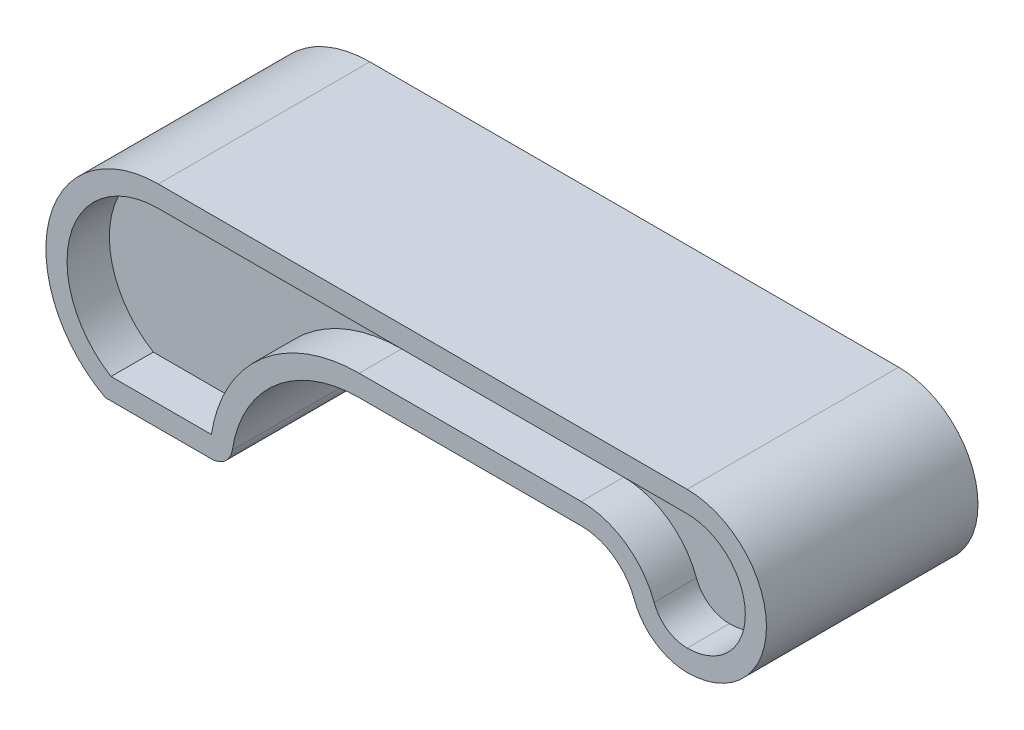
ISO-10303-21;
HEADER;
FILE_DESCRIPTION(('STEP AP214'),'2;1');
FILE_NAME('part.step','',(''),(''),'','','');
FILE_SCHEMA(('AUTOMOTIVE_DESIGN { 1 0 10303 214 1 1 1 1 }'));
ENDSEC;
DATA;
#1=APPLICATION_CONTEXT('core data for automotive mechanical design processes');
#2=APPLICATION_PROTOCOL_DEFINITION('international standard','automotive_design',2000,#1);
#3=PRODUCT_CONTEXT('',#1,'mechanical');
#4=PRODUCT('Part','Part','',(#3));
#5=PRODUCT_RELATED_PRODUCT_CATEGORY('part','',(#4));
#6=PRODUCT_DEFINITION_FORMATION('','',#4);
#7=PRODUCT_DEFINITION_CONTEXT('part definition',#1,'design');
#8=PRODUCT_DEFINITION('design','',#6,#7);
#9=PRODUCT_DEFINITION_SHAPE('','',#8);
#10=(LENGTH_UNIT() NAMED_UNIT(*) SI_UNIT(.MILLI.,.METRE.));
#11=(NAMED_UNIT(*) PLANE_ANGLE_UNIT() SI_UNIT($,.RADIAN.));
#12=(NAMED_UNIT(*) SI_UNIT($,.STERADIAN.) SOLID_ANGLE_UNIT());
#13=UNCERTAINTY_MEASURE_WITH_UNIT(LENGTH_MEASURE(1.E-05),#10,'distance_accuracy_value','');
#14=(GEOMETRIC_REPRESENTATION_CONTEXT(3) GLOBAL_UNCERTAINTY_ASSIGNED_CONTEXT((#13)) GLOBAL_UNIT_ASSIGNED_CONTEXT((#10,
#11,#12)) REPRESENTATION_CONTEXT('',''));
#15=CARTESIAN_POINT('',(0.,0.,0.));
#16=DIRECTION('',(0.,0.,1.));
#17=DIRECTION('',(1.,0.,0.));
#18=AXIS2_PLACEMENT_3D('',#15,#16,#17);
#19=CARTESIAN_POINT('',(10.,2.02380952380952,0.));
#20=DIRECTION('',(0.,0.,1.));
#21=DIRECTION('',(1.,0.,0.));
#22=AXIS2_PLACEMENT_3D('',#19,#20,#21);
#23=PLANE('',#22);
#24=CARTESIAN_POINT('',(10.,2.02380952380952,0.));
#25=DIRECTION('',(0.,0.,1.));
#26=DIRECTION('',(1.,0.,0.));
#27=AXIS2_PLACEMENT_3D('',#24,#25,#26);
#28=CIRCLE('',#27,2.02380952380953);
#29=CARTESIAN_POINT('',(10.,0.,0.));
#30=VERTEX_POINT('',#29);
#31=CARTESIAN_POINT('',(12.,1.71428571428572,0.));
#32=VERTEX_POINT('',#31);
#33=EDGE_CURVE('E344',#30,#32,#28,.T.);
#34=ORIENTED_EDGE('',*,*,#33,.F.);
#35=DIRECTION('',(1.,0.,0.));
#36=VECTOR('',#35,1.);
#37=CARTESIAN_POINT('',(0.,0.,0.));
#38=LINE('',#37,#36);
#39=CARTESIAN_POINT('',(0.,0.,0.));
#40=VERTEX_POINT('',#39);
#41=EDGE_CURVE('E364',#40,#30,#38,.T.);
#42=ORIENTED_EDGE('',*,*,#41,.F.);
#43=CARTESIAN_POINT('',(5.,9.375,0.));
#44=DIRECTION('',(0.,0.,-1.));
#45=DIRECTION('',(-1.,0.,0.));
#46=AXIS2_PLACEMENT_3D('',#43,#44,#45);
#47=CIRCLE('',#46,10.625);
#48=CARTESIAN_POINT('',(5.,20.,0.));
#49=VERTEX_POINT('',#48);
#50=EDGE_CURVE('E407',#40,#49,#47,.T.);
#51=ORIENTED_EDGE('',*,*,#50,.T.);
#52=DIRECTION('',(1.,0.,0.));
#53=VECTOR('',#52,1.);
#54=CARTESIAN_POINT('',(5.,20.,0.));
#55=LINE('',#54,#53);
#56=CARTESIAN_POINT('',(55.,20.,0.));
#57=VERTEX_POINT('',#56);
#58=EDGE_CURVE('E404',#49,#57,#55,.T.);
#59=ORIENTED_EDGE('',*,*,#58,.T.);
#60=CARTESIAN_POINT('',(55.,12.5,0.));
#61=DIRECTION('',(0.,0.,-1.));
#62=DIRECTION('',(-1.,0.,0.));
#63=AXIS2_PLACEMENT_3D('',#60,#61,#62);
#64=CIRCLE('',#63,7.5);
#65=CARTESIAN_POINT('',(55.,5.,0.));
#66=VERTEX_POINT('',#65);
#67=EDGE_CURVE('E401',#57,#66,#64,.T.);
#68=ORIENTED_EDGE('',*,*,#67,.T.);
#69=CARTESIAN_POINT('',(55.,10.3214285714286,0.));
#70=DIRECTION('',(0.,0.,-1.));
#71=DIRECTION('',(-1.,0.,0.));
#72=AXIS2_PLACEMENT_3D('',#69,#70,#71);
#73=CIRCLE('',#72,5.32142857142856);
#74=CARTESIAN_POINT('',(50.,8.5,0.));
#75=VERTEX_POINT('',#74);
#76=EDGE_CURVE('E398',#66,#75,#73,.T.);
#77=ORIENTED_EDGE('',*,*,#76,.T.);
#78=CARTESIAN_POINT('',(45.,6.67857142857144,0.));
#79=DIRECTION('',(0.,0.,1.));
#80=DIRECTION('',(1.,0.,0.));
#81=AXIS2_PLACEMENT_3D('',#78,#79,#80);
#82=CIRCLE('',#81,5.32142857142857);
#83=CARTESIAN_POINT('',(45.,12.,0.));
#84=VERTEX_POINT('',#83);
#85=EDGE_CURVE('E395',#75,#84,#82,.T.);
#86=ORIENTED_EDGE('',*,*,#85,.T.);
#87=DIRECTION('',(-1.,0.,0.));
#88=VECTOR('',#87,1.);
#89=CARTESIAN_POINT('',(45.,12.,0.));
#90=LINE('',#89,#88);
#91=CARTESIAN_POINT('',(24.,12.,0.));
#92=VERTEX_POINT('',#91);
#93=EDGE_CURVE('E392',#84,#92,#90,.T.);
#94=ORIENTED_EDGE('',*,*,#93,.T.);
#95=CARTESIAN_POINT('',(24.,-0.142857142857146,0.));
#96=DIRECTION('',(0.,0.,-1.));
#97=DIRECTION('',(-1.,0.,0.));
#98=AXIS2_PLACEMENT_3D('',#95,#96,#97);
#99=CIRCLE('',#98,12.1428571428571);
#100=EDGE_CURVE('E389',#32,#92,#99,.T.);
#101=ORIENTED_EDGE('',*,*,#100,.F.);
#102=EDGE_LOOP('',(#34,#42,#51,#59,#68,#77,#86,#94,#101));
#103=FACE_BOUND('',#102,.T.);
#104=CARTESIAN_POINT('',(10.,2.02380952380952,0.));
#105=DIRECTION('',(0.,0.,1.));
#106=DIRECTION('',(1.,0.,0.));
#107=AXIS2_PLACEMENT_3D('',#104,#105,#106);
#108=CIRCLE('',#107,0.0238095238095249);
#109=CARTESIAN_POINT('',(10.,2.,0.));
#110=VERTEX_POINT('',#109);
#111=CARTESIAN_POINT('',(10.0235294117647,2.02016806722689,0.));
#112=VERTEX_POINT('',#111);
#113=EDGE_CURVE('E47',#110,#112,#108,.T.);
#114=ORIENTED_EDGE('',*,*,#113,.T.);
#115=CARTESIAN_POINT('',(24.,-0.142857142857146,0.));
#116=DIRECTION('',(0.,0.,-1.));
#117=DIRECTION('',(1.,0.,0.));
#118=AXIS2_PLACEMENT_3D('',#115,#116,#117);
#119=CIRCLE('',#118,14.1428571428571);
#120=CARTESIAN_POINT('',(24.,14.,0.));
#121=VERTEX_POINT('',#120);
#122=EDGE_CURVE('E232',#112,#121,#119,.T.);
#123=ORIENTED_EDGE('',*,*,#122,.T.);
#124=DIRECTION('',(1.,0.,0.));
#125=VECTOR('',#124,1.);
#126=CARTESIAN_POINT('',(24.,14.,0.));
#127=LINE('',#126,#125);
#128=CARTESIAN_POINT('',(45.,14.,0.));
#129=VERTEX_POINT('',#128);
#130=EDGE_CURVE('E235',#121,#129,#127,.T.);
#131=ORIENTED_EDGE('',*,*,#130,.T.);
#132=CARTESIAN_POINT('',(45.,6.67857142857144,0.));
#133=DIRECTION('',(0.,0.,-1.));
#134=DIRECTION('',(1.,0.,0.));
#135=AXIS2_PLACEMENT_3D('',#132,#133,#134);
#136=CIRCLE('',#135,7.32142857142856);
#137=CARTESIAN_POINT('',(51.8791946308725,9.18456375838926,0.));
#138=VERTEX_POINT('',#137);
#139=EDGE_CURVE('E269',#129,#138,#136,.T.);
#140=ORIENTED_EDGE('',*,*,#139,.T.);
#141=CARTESIAN_POINT('',(55.,10.3214285714286,0.));
#142=DIRECTION('',(0.,0.,1.));
#143=DIRECTION('',(1.,0.,0.));
#144=AXIS2_PLACEMENT_3D('',#141,#142,#143);
#145=CIRCLE('',#144,3.32142857142856);
#146=CARTESIAN_POINT('',(55.,7.,0.));
#147=VERTEX_POINT('',#146);
#148=EDGE_CURVE('E266',#138,#147,#145,.T.);
#149=ORIENTED_EDGE('',*,*,#148,.T.);
#150=CARTESIAN_POINT('',(55.,12.5,0.));
#151=DIRECTION('',(0.,0.,1.));
#152=DIRECTION('',(1.,0.,0.));
#153=AXIS2_PLACEMENT_3D('',#150,#151,#152);
#154=CIRCLE('',#153,5.5);
#155=CARTESIAN_POINT('',(55.,18.,0.));
#156=VERTEX_POINT('',#155);
#157=EDGE_CURVE('E263',#147,#156,#154,.T.);
#158=ORIENTED_EDGE('',*,*,#157,.T.);
#159=DIRECTION('',(-1.,0.,0.));
#160=VECTOR('',#159,1.);
#161=CARTESIAN_POINT('',(55.,18.,0.));
#162=LINE('',#161,#160);
#163=CARTESIAN_POINT('',(5.,18.,0.));
#164=VERTEX_POINT('',#163);
#165=EDGE_CURVE('E260',#156,#164,#162,.T.);
#166=ORIENTED_EDGE('',*,*,#165,.T.);
#167=CARTESIAN_POINT('',(5.,9.375,0.));
#168=DIRECTION('',(0.,0.,1.));
#169=DIRECTION('',(1.,0.,0.));
#170=AXIS2_PLACEMENT_3D('',#167,#168,#169);
#171=CIRCLE('',#170,8.625);
#172=CARTESIAN_POINT('',(0.527864045000413,2.,0.));
#173=VERTEX_POINT('',#172);
#174=EDGE_CURVE('E257',#164,#173,#171,.T.);
#175=ORIENTED_EDGE('',*,*,#174,.T.);
#176=DIRECTION('',(1.,0.,0.));
#177=VECTOR('',#176,1.);
#178=CARTESIAN_POINT('',(0.527864045000413,2.,0.));
#179=LINE('',#178,#177);
#180=EDGE_CURVE('E254',#173,#110,#179,.T.);
#181=ORIENTED_EDGE('',*,*,#180,.T.);
#182=EDGE_LOOP('',(#114,#123,#131,#140,#149,#158,#166,#175,#181));
#183=FACE_BOUND('',#182,.T.);
#184=ADVANCED_FACE('F32',(#103,#183),#23,.F.);
#185=CARTESIAN_POINT('',(10.,2.02380952380952,20.));
#186=DIRECTION('',(0.,0.,1.));
#187=DIRECTION('',(1.,0.,0.));
#188=AXIS2_PLACEMENT_3D('',#185,#186,#187);
#189=PLANE('',#188);
#190=CARTESIAN_POINT('',(10.,2.02380952380952,20.));
#191=DIRECTION('',(0.,0.,1.));
#192=DIRECTION('',(1.,0.,0.));
#193=AXIS2_PLACEMENT_3D('',#190,#191,#192);
#194=CIRCLE('',#193,2.02380952380953);
#195=CARTESIAN_POINT('',(10.,0.,20.));
#196=VERTEX_POINT('',#195);
#197=CARTESIAN_POINT('',(12.,1.71428571428572,20.));
#198=VERTEX_POINT('',#197);
#199=EDGE_CURVE('E360',#196,#198,#194,.T.);
#200=ORIENTED_EDGE('',*,*,#199,.T.);
#201=CARTESIAN_POINT('',(24.,-0.142857142857146,20.));
#202=DIRECTION('',(0.,0.,-1.));
#203=DIRECTION('',(-1.,0.,0.));
#204=AXIS2_PLACEMENT_3D('',#201,#202,#203);
#205=CIRCLE('',#204,12.1428571428571);
#206=CARTESIAN_POINT('',(24.,12.,20.));
#207=VERTEX_POINT('',#206);
#208=EDGE_CURVE('E363',#198,#207,#205,.T.);
#209=ORIENTED_EDGE('',*,*,#208,.T.);
#210=DIRECTION('',(-1.,0.,0.));
#211=VECTOR('',#210,1.);
#212=CARTESIAN_POINT('',(45.,12.,20.));
#213=LINE('',#212,#211);
#214=CARTESIAN_POINT('',(45.,12.,20.));
#215=VERTEX_POINT('',#214);
#216=EDGE_CURVE('E366',#215,#207,#213,.T.);
#217=ORIENTED_EDGE('',*,*,#216,.F.);
#218=CARTESIAN_POINT('',(45.,6.67857142857144,20.));
#219=DIRECTION('',(0.,0.,1.));
#220=DIRECTION('',(1.,0.,0.));
#221=AXIS2_PLACEMENT_3D('',#218,#219,#220);
#222=CIRCLE('',#221,5.32142857142857);
#223=CARTESIAN_POINT('',(50.,8.5,20.));
#224=VERTEX_POINT('',#223);
#225=EDGE_CURVE('E369',#224,#215,#222,.T.);
#226=ORIENTED_EDGE('',*,*,#225,.F.);
#227=CARTESIAN_POINT('',(55.,10.3214285714286,20.));
#228=DIRECTION('',(0.,0.,-1.));
#229=DIRECTION('',(-1.,0.,0.));
#230=AXIS2_PLACEMENT_3D('',#227,#228,#229);
#231=CIRCLE('',#230,5.32142857142856);
#232=CARTESIAN_POINT('',(55.,5.,20.));
#233=VERTEX_POINT('',#232);
#234=EDGE_CURVE('E372',#233,#224,#231,.T.);
#235=ORIENTED_EDGE('',*,*,#234,.F.);
#236=CARTESIAN_POINT('',(55.,12.5,20.));
#237=DIRECTION('',(0.,0.,-1.));
#238=DIRECTION('',(-1.,0.,0.));
#239=AXIS2_PLACEMENT_3D('',#236,#237,#238);
#240=CIRCLE('',#239,7.5);
#241=CARTESIAN_POINT('',(55.,20.,20.));
#242=VERTEX_POINT('',#241);
#243=EDGE_CURVE('E375',#242,#233,#240,.T.);
#244=ORIENTED_EDGE('',*,*,#243,.F.);
#245=DIRECTION('',(1.,0.,0.));
#246=VECTOR('',#245,1.);
#247=CARTESIAN_POINT('',(5.,20.,20.));
#248=LINE('',#247,#246);
#249=CARTESIAN_POINT('',(5.,20.,20.));
#250=VERTEX_POINT('',#249);
#251=EDGE_CURVE('E378',#250,#242,#248,.T.);
#252=ORIENTED_EDGE('',*,*,#251,.F.);
#253=CARTESIAN_POINT('',(5.,9.375,20.));
#254=DIRECTION('',(0.,0.,-1.));
#255=DIRECTION('',(-1.,0.,0.));
#256=AXIS2_PLACEMENT_3D('',#253,#254,#255);
#257=CIRCLE('',#256,10.625);
#258=CARTESIAN_POINT('',(0.,0.,20.));
#259=VERTEX_POINT('',#258);
#260=EDGE_CURVE('E381',#259,#250,#257,.T.);
#261=ORIENTED_EDGE('',*,*,#260,.F.);
#262=DIRECTION('',(1.,0.,0.));
#263=VECTOR('',#262,1.);
#264=CARTESIAN_POINT('',(0.,0.,20.));
#265=LINE('',#264,#263);
#266=EDGE_CURVE('E384',#259,#196,#265,.T.);
#267=ORIENTED_EDGE('',*,*,#266,.T.);
#268=EDGE_LOOP('',(#200,#209,#217,#226,#235,#244,#252,#261,#267));
#269=FACE_BOUND('',#268,.T.);
#270=CARTESIAN_POINT('',(10.,2.02380952380952,20.));
#271=DIRECTION('',(0.,0.,1.));
#272=DIRECTION('',(1.,0.,0.));
#273=AXIS2_PLACEMENT_3D('',#270,#271,#272);
#274=CIRCLE('',#273,0.0238095238095249);
#275=CARTESIAN_POINT('',(10.,2.,20.));
#276=VERTEX_POINT('',#275);
#277=CARTESIAN_POINT('',(10.0235294117647,2.02016806722689,20.));
#278=VERTEX_POINT('',#277);
#279=EDGE_CURVE('E55',#276,#278,#274,.T.);
#280=ORIENTED_EDGE('',*,*,#279,.F.);
#281=DIRECTION('',(1.,0.,0.));
#282=VECTOR('',#281,1.);
#283=CARTESIAN_POINT('',(0.527864045000413,2.,20.));
#284=LINE('',#283,#282);
#285=CARTESIAN_POINT('',(0.527864045000413,2.,20.));
#286=VERTEX_POINT('',#285);
#287=EDGE_CURVE('E293',#286,#276,#284,.T.);
#288=ORIENTED_EDGE('',*,*,#287,.F.);
#289=CARTESIAN_POINT('',(5.,9.375,20.));
#290=DIRECTION('',(0.,0.,1.));
#291=DIRECTION('',(1.,0.,0.));
#292=AXIS2_PLACEMENT_3D('',#289,#290,#291);
#293=CIRCLE('',#292,8.625);
#294=CARTESIAN_POINT('',(5.,18.,20.));
#295=VERTEX_POINT('',#294);
#296=EDGE_CURVE('E337',#295,#286,#293,.T.);
#297=ORIENTED_EDGE('',*,*,#296,.F.);
#298=DIRECTION('',(-1.,0.,0.));
#299=VECTOR('',#298,1.);
#300=CARTESIAN_POINT('',(55.,18.,20.));
#301=LINE('',#300,#299);
#302=CARTESIAN_POINT('',(55.,18.,20.));
#303=VERTEX_POINT('',#302);
#304=EDGE_CURVE('E334',#303,#295,#301,.T.);
#305=ORIENTED_EDGE('',*,*,#304,.F.);
#306=CARTESIAN_POINT('',(55.,12.5,20.));
#307=DIRECTION('',(0.,0.,1.));
#308=DIRECTION('',(1.,0.,0.));
#309=AXIS2_PLACEMENT_3D('',#306,#307,#308);
#310=CIRCLE('',#309,5.5);
#311=CARTESIAN_POINT('',(55.,7.,20.));
#312=VERTEX_POINT('',#311);
#313=EDGE_CURVE('E331',#312,#303,#310,.T.);
#314=ORIENTED_EDGE('',*,*,#313,.F.);
#315=CARTESIAN_POINT('',(55.,10.3214285714286,20.));
#316=DIRECTION('',(0.,0.,1.));
#317=DIRECTION('',(1.,0.,0.));
#318=AXIS2_PLACEMENT_3D('',#315,#316,#317);
#319=CIRCLE('',#318,3.32142857142856);
#320=CARTESIAN_POINT('',(51.8791946308725,9.18456375838926,20.));
#321=VERTEX_POINT('',#320);
#322=EDGE_CURVE('E328',#321,#312,#319,.T.);
#323=ORIENTED_EDGE('',*,*,#322,.F.);
#324=CARTESIAN_POINT('',(45.,6.67857142857144,20.));
#325=DIRECTION('',(0.,0.,-1.));
#326=DIRECTION('',(1.,0.,0.));
#327=AXIS2_PLACEMENT_3D('',#324,#325,#326);
#328=CIRCLE('',#327,7.32142857142856);
#329=CARTESIAN_POINT('',(45.,14.,20.));
#330=VERTEX_POINT('',#329);
#331=EDGE_CURVE('E325',#330,#321,#328,.T.);
#332=ORIENTED_EDGE('',*,*,#331,.F.);
#333=DIRECTION('',(1.,0.,0.));
#334=VECTOR('',#333,1.);
#335=CARTESIAN_POINT('',(24.,14.,20.));
#336=LINE('',#335,#334);
#337=CARTESIAN_POINT('',(24.,14.,20.));
#338=VERTEX_POINT('',#337);
#339=EDGE_CURVE('E322',#338,#330,#336,.T.);
#340=ORIENTED_EDGE('',*,*,#339,.F.);
#341=CARTESIAN_POINT('',(24.,-0.142857142857146,20.));
#342=DIRECTION('',(0.,0.,-1.));
#343=DIRECTION('',(1.,0.,0.));
#344=AXIS2_PLACEMENT_3D('',#341,#342,#343);
#345=CIRCLE('',#344,14.1428571428571);
#346=EDGE_CURVE('E319',#278,#338,#345,.T.);
#347=ORIENTED_EDGE('',*,*,#346,.F.);
#348=EDGE_LOOP('',(#280,#288,#297,#305,#314,#323,#332,#340,#347));
#349=FACE_BOUND('',#348,.T.);
#350=ADVANCED_FACE('F441',(#269,#349),#189,.T.);
#351=CARTESIAN_POINT('',(10.,2.02380952380952,20.));
#352=DIRECTION('',(0.,0.,-1.));
#353=DIRECTION('',(-1.,0.,0.));
#354=AXIS2_PLACEMENT_3D('',#351,#352,#353);
#355=CYLINDRICAL_SURFACE('',#354,2.02380952380953);
#356=ORIENTED_EDGE('',*,*,#33,.T.);
#357=DIRECTION('',(0.,0.,-1.));
#358=VECTOR('',#357,1.);
#359=CARTESIAN_POINT('',(12.,1.71428571428572,20.));
#360=LINE('',#359,#358);
#361=EDGE_CURVE('E11',#198,#32,#360,.T.);
#362=ORIENTED_EDGE('',*,*,#361,.F.);
#363=ORIENTED_EDGE('',*,*,#199,.F.);
#364=DIRECTION('',(0.,0.,-1.));
#365=VECTOR('',#364,1.);
#366=CARTESIAN_POINT('',(10.,0.,20.));
#367=LINE('',#366,#365);
#368=EDGE_CURVE('E386',#196,#30,#367,.T.);
#369=ORIENTED_EDGE('',*,*,#368,.T.);
#370=EDGE_LOOP('',(#356,#362,#363,#369));
#371=FACE_BOUND('',#370,.T.);
#372=ADVANCED_FACE('F34',(#371),#355,.T.);
#373=CARTESIAN_POINT('',(24.,-0.142857142857146,20.));
#374=DIRECTION('',(0.,0.,-1.));
#375=DIRECTION('',(-1.,0.,0.));
#376=AXIS2_PLACEMENT_3D('',#373,#374,#375);
#377=CYLINDRICAL_SURFACE('',#376,12.1428571428571);
#378=ORIENTED_EDGE('',*,*,#100,.T.);
#379=DIRECTION('',(0.,0.,-1.));
#380=VECTOR('',#379,1.);
#381=CARTESIAN_POINT('',(24.,12.,20.));
#382=LINE('',#381,#380);
#383=EDGE_CURVE('E40',#207,#92,#382,.T.);
#384=ORIENTED_EDGE('',*,*,#383,.F.);
#385=ORIENTED_EDGE('',*,*,#208,.F.);
#386=ORIENTED_EDGE('',*,*,#361,.T.);
#387=EDGE_LOOP('',(#378,#384,#385,#386));
#388=FACE_BOUND('',#387,.T.);
#389=ADVANCED_FACE('F430',(#388),#377,.F.);
#390=CARTESIAN_POINT('',(45.,12.,20.));
#391=DIRECTION('',(0.,-1.,0.));
#392=DIRECTION('',(0.,0.,-1.));
#393=AXIS2_PLACEMENT_3D('',#390,#391,#392);
#394=PLANE('',#393);
#395=ORIENTED_EDGE('',*,*,#93,.F.);
#396=DIRECTION('',(0.,0.,-1.));
#397=VECTOR('',#396,1.);
#398=CARTESIAN_POINT('',(45.,12.,20.));
#399=LINE('',#398,#397);
#400=EDGE_CURVE('E423',#215,#84,#399,.T.);
#401=ORIENTED_EDGE('',*,*,#400,.F.);
#402=ORIENTED_EDGE('',*,*,#216,.T.);
#403=ORIENTED_EDGE('',*,*,#383,.T.);
#404=EDGE_LOOP('',(#395,#401,#402,#403));
#405=FACE_BOUND('',#404,.T.);
#406=ADVANCED_FACE('F427',(#405),#394,.T.);
#407=CARTESIAN_POINT('',(45.,6.67857142857144,20.));
#408=DIRECTION('',(0.,0.,-1.));
#409=DIRECTION('',(-1.,0.,0.));
#410=AXIS2_PLACEMENT_3D('',#407,#408,#409);
#411=CYLINDRICAL_SURFACE('',#410,5.32142857142857);
#412=ORIENTED_EDGE('',*,*,#85,.F.);
#413=DIRECTION('',(0.,0.,-1.));
#414=VECTOR('',#413,1.);
#415=CARTESIAN_POINT('',(50.,8.5,20.));
#416=LINE('',#415,#414);
#417=EDGE_CURVE('E421',#224,#75,#416,.T.);
#418=ORIENTED_EDGE('',*,*,#417,.F.);
#419=ORIENTED_EDGE('',*,*,#225,.T.);
#420=ORIENTED_EDGE('',*,*,#400,.T.);
#421=EDGE_LOOP('',(#412,#418,#419,#420));
#422=FACE_BOUND('',#421,.T.);
#423=ADVANCED_FACE('F438',(#422),#411,.F.);
#424=CARTESIAN_POINT('',(55.,10.3214285714286,20.));
#425=DIRECTION('',(0.,0.,-1.));
#426=DIRECTION('',(-1.,0.,0.));
#427=AXIS2_PLACEMENT_3D('',#424,#425,#426);
#428=CYLINDRICAL_SURFACE('',#427,5.32142857142856);
#429=ORIENTED_EDGE('',*,*,#76,.F.);
#430=DIRECTION('',(0.,0.,-1.));
#431=VECTOR('',#430,1.);
#432=CARTESIAN_POINT('',(55.,5.,20.));
#433=LINE('',#432,#431);
#434=EDGE_CURVE('E419',#233,#66,#433,.T.);
#435=ORIENTED_EDGE('',*,*,#434,.F.);
#436=ORIENTED_EDGE('',*,*,#234,.T.);
#437=ORIENTED_EDGE('',*,*,#417,.T.);
#438=EDGE_LOOP('',(#429,#435,#436,#437));
#439=FACE_BOUND('',#438,.T.);
#440=ADVANCED_FACE('F463',(#439),#428,.T.);
#441=CARTESIAN_POINT('',(55.,12.5,20.));
#442=DIRECTION('',(0.,0.,-1.));
#443=DIRECTION('',(-1.,0.,0.));
#444=AXIS2_PLACEMENT_3D('',#441,#442,#443);
#445=CYLINDRICAL_SURFACE('',#444,7.5);
#446=ORIENTED_EDGE('',*,*,#67,.F.);
#447=DIRECTION('',(0.,0.,-1.));
#448=VECTOR('',#447,1.);
#449=CARTESIAN_POINT('',(55.,20.,20.));
#450=LINE('',#449,#448);
#451=EDGE_CURVE('E417',#242,#57,#450,.T.);
#452=ORIENTED_EDGE('',*,*,#451,.F.);
#453=ORIENTED_EDGE('',*,*,#243,.T.);
#454=ORIENTED_EDGE('',*,*,#434,.T.);
#455=EDGE_LOOP('',(#446,#452,#453,#454));
#456=FACE_BOUND('',#455,.T.);
#457=ADVANCED_FACE('F460',(#456),#445,.T.);
#458=CARTESIAN_POINT('',(5.,20.,20.));
#459=DIRECTION('',(0.,1.,0.));
#460=DIRECTION('',(-1.,0.,0.));
#461=AXIS2_PLACEMENT_3D('',#458,#459,#460);
#462=PLANE('',#461);
#463=ORIENTED_EDGE('',*,*,#58,.F.);
#464=DIRECTION('',(0.,0.,-1.));
#465=VECTOR('',#464,1.);
#466=CARTESIAN_POINT('',(5.,20.,20.));
#467=LINE('',#466,#465);
#468=EDGE_CURVE('E415',#250,#49,#467,.T.);
#469=ORIENTED_EDGE('',*,*,#468,.F.);
#470=ORIENTED_EDGE('',*,*,#251,.T.);
#471=ORIENTED_EDGE('',*,*,#451,.T.);
#472=EDGE_LOOP('',(#463,#469,#470,#471));
#473=FACE_BOUND('',#472,.T.);
#474=ADVANCED_FACE('F457',(#473),#462,.T.);
#475=CARTESIAN_POINT('',(5.,9.375,20.));
#476=DIRECTION('',(0.,0.,-1.));
#477=DIRECTION('',(-1.,0.,0.));
#478=AXIS2_PLACEMENT_3D('',#475,#476,#477);
#479=CYLINDRICAL_SURFACE('',#478,10.625);
#480=ORIENTED_EDGE('',*,*,#50,.F.);
#481=DIRECTION('',(0.,0.,-1.));
#482=VECTOR('',#481,1.);
#483=CARTESIAN_POINT('',(0.,0.,20.));
#484=LINE('',#483,#482);
#485=EDGE_CURVE('E413',#259,#40,#484,.T.);
#486=ORIENTED_EDGE('',*,*,#485,.F.);
#487=ORIENTED_EDGE('',*,*,#260,.T.);
#488=ORIENTED_EDGE('',*,*,#468,.T.);
#489=EDGE_LOOP('',(#480,#486,#487,#488));
#490=FACE_BOUND('',#489,.T.);
#491=ADVANCED_FACE('F453',(#490),#479,.T.);
#492=CARTESIAN_POINT('',(0.,0.,20.));
#493=DIRECTION('',(0.,1.,0.));
#494=DIRECTION('',(0.,0.,1.));
#495=AXIS2_PLACEMENT_3D('',#492,#493,#494);
#496=PLANE('',#495);
#497=CARTESIAN_POINT('',(5.,0.,10.));
#498=DIRECTION('',(0.,-1.,0.));
#499=DIRECTION('',(0.,0.,-1.));
#500=AXIS2_PLACEMENT_3D('',#497,#498,#499);
#501=CIRCLE('',#500,4.);
#502=CARTESIAN_POINT('',(5.,0.,6.));
#503=VERTEX_POINT('',#502);
#504=EDGE_CURVE('E238',#503,#503,#501,.T.);
#505=ORIENTED_EDGE('',*,*,#504,.F.);
#506=EDGE_LOOP('',(#505));
#507=FACE_BOUND('',#506,.T.);
#508=ORIENTED_EDGE('',*,*,#41,.T.);
#509=ORIENTED_EDGE('',*,*,#368,.F.);
#510=ORIENTED_EDGE('',*,*,#266,.F.);
#511=ORIENTED_EDGE('',*,*,#485,.T.);
#512=EDGE_LOOP('',(#508,#509,#510,#511));
#513=FACE_BOUND('',#512,.T.);
#514=ADVANCED_FACE('F480',(#507,#513),#496,.F.);
#515=CARTESIAN_POINT('',(10.,2.02380952380952,16.));
#516=DIRECTION('',(0.,0.,1.));
#517=DIRECTION('',(1.,0.,0.));
#518=AXIS2_PLACEMENT_3D('',#515,#516,#517);
#519=CYLINDRICAL_SURFACE('',#518,0.0238095238095249);
#520=ORIENTED_EDGE('',*,*,#279,.T.);
#521=DIRECTION('',(0.,0.,1.));
#522=VECTOR('',#521,1.);
#523=CARTESIAN_POINT('',(10.0235294117647,2.02016806722689,16.));
#524=LINE('',#523,#522);
#525=CARTESIAN_POINT('',(10.0235294117647,2.02016806722689,16.));
#526=VERTEX_POINT('',#525);
#527=EDGE_CURVE('E317',#526,#278,#524,.T.);
#528=ORIENTED_EDGE('',*,*,#527,.F.);
#529=CARTESIAN_POINT('',(10.,2.02380952380952,16.));
#530=DIRECTION('',(0.,0.,1.));
#531=DIRECTION('',(1.,0.,0.));
#532=AXIS2_PLACEMENT_3D('',#529,#530,#531);
#533=CIRCLE('',#532,0.0238095238095249);
#534=CARTESIAN_POINT('',(10.,2.,16.));
#535=VERTEX_POINT('',#534);
#536=EDGE_CURVE('E289',#535,#526,#533,.T.);
#537=ORIENTED_EDGE('',*,*,#536,.F.);
#538=DIRECTION('',(0.,0.,1.));
#539=VECTOR('',#538,1.);
#540=CARTESIAN_POINT('',(10.,2.,16.));
#541=LINE('',#540,#539);
#542=EDGE_CURVE('E342',#535,#276,#541,.T.);
#543=ORIENTED_EDGE('',*,*,#542,.T.);
#544=EDGE_LOOP('',(#520,#528,#537,#543));
#545=FACE_BOUND('',#544,.T.);
#546=ADVANCED_FACE('F483',(#545),#519,.F.);
#547=CARTESIAN_POINT('',(0.527864045000413,2.,16.));
#548=DIRECTION('',(0.,-1.,0.));
#549=DIRECTION('',(1.,0.,0.));
#550=AXIS2_PLACEMENT_3D('',#547,#548,#549);
#551=PLANE('',#550);
#552=ORIENTED_EDGE('',*,*,#287,.T.);
#553=ORIENTED_EDGE('',*,*,#542,.F.);
#554=DIRECTION('',(1.,0.,0.));
#555=VECTOR('',#554,1.);
#556=CARTESIAN_POINT('',(0.527864045000413,2.,16.));
#557=LINE('',#556,#555);
#558=CARTESIAN_POINT('',(0.527864045000413,2.,16.));
#559=VERTEX_POINT('',#558);
#560=EDGE_CURVE('E314',#559,#535,#557,.T.);
#561=ORIENTED_EDGE('',*,*,#560,.F.);
#562=DIRECTION('',(0.,0.,1.));
#563=VECTOR('',#562,1.);
#564=CARTESIAN_POINT('',(0.527864045000413,2.,16.));
#565=LINE('',#564,#563);
#566=EDGE_CURVE('E345',#559,#286,#565,.T.);
#567=ORIENTED_EDGE('',*,*,#566,.T.);
#568=EDGE_LOOP('',(#552,#553,#561,#567));
#569=FACE_BOUND('',#568,.T.);
#570=ADVANCED_FACE('F509',(#569),#551,.F.);
#571=CARTESIAN_POINT('',(5.,9.375,16.));
#572=DIRECTION('',(0.,0.,1.));
#573=DIRECTION('',(1.,0.,0.));
#574=AXIS2_PLACEMENT_3D('',#571,#572,#573);
#575=CYLINDRICAL_SURFACE('',#574,8.625);
#576=ORIENTED_EDGE('',*,*,#296,.T.);
#577=ORIENTED_EDGE('',*,*,#566,.F.);
#578=CARTESIAN_POINT('',(5.,9.375,16.));
#579=DIRECTION('',(0.,0.,1.));
#580=DIRECTION('',(1.,0.,0.));
#581=AXIS2_PLACEMENT_3D('',#578,#579,#580);
#582=CIRCLE('',#581,8.625);
#583=CARTESIAN_POINT('',(5.,18.,16.));
#584=VERTEX_POINT('',#583);
#585=EDGE_CURVE('E311',#584,#559,#582,.T.);
#586=ORIENTED_EDGE('',*,*,#585,.F.);
#587=DIRECTION('',(0.,0.,1.));
#588=VECTOR('',#587,1.);
#589=CARTESIAN_POINT('',(5.,18.,16.));
#590=LINE('',#589,#588);
#591=EDGE_CURVE('E347',#584,#295,#590,.T.);
#592=ORIENTED_EDGE('',*,*,#591,.T.);
#593=EDGE_LOOP('',(#576,#577,#586,#592));
#594=FACE_BOUND('',#593,.T.);
#595=ADVANCED_FACE('F515',(#594),#575,.F.);
#596=CARTESIAN_POINT('',(55.,18.,16.));
#597=DIRECTION('',(0.,1.,0.));
#598=DIRECTION('',(0.,0.,1.));
#599=AXIS2_PLACEMENT_3D('',#596,#597,#598);
#600=PLANE('',#599);
#601=ORIENTED_EDGE('',*,*,#304,.T.);
#602=ORIENTED_EDGE('',*,*,#591,.F.);
#603=DIRECTION('',(-1.,0.,0.));
#604=VECTOR('',#603,1.);
#605=CARTESIAN_POINT('',(55.,18.,16.));
#606=LINE('',#605,#604);
#607=CARTESIAN_POINT('',(55.,18.,16.));
#608=VERTEX_POINT('',#607);
#609=EDGE_CURVE('E308',#608,#584,#606,.T.);
#610=ORIENTED_EDGE('',*,*,#609,.F.);
#611=DIRECTION('',(0.,0.,1.));
#612=VECTOR('',#611,1.);
#613=CARTESIAN_POINT('',(55.,18.,16.));
#614=LINE('',#613,#612);
#615=EDGE_CURVE('E349',#608,#303,#614,.T.);
#616=ORIENTED_EDGE('',*,*,#615,.T.);
#617=EDGE_LOOP('',(#601,#602,#610,#616));
#618=FACE_BOUND('',#617,.T.);
#619=ADVANCED_FACE('F523',(#618),#600,.F.);
#620=CARTESIAN_POINT('',(55.,12.5,16.));
#621=DIRECTION('',(0.,0.,1.));
#622=DIRECTION('',(1.,0.,0.));
#623=AXIS2_PLACEMENT_3D('',#620,#621,#622);
#624=CYLINDRICAL_SURFACE('',#623,5.5);
#625=ORIENTED_EDGE('',*,*,#313,.T.);
#626=ORIENTED_EDGE('',*,*,#615,.F.);
#627=CARTESIAN_POINT('',(55.,12.5,16.));
#628=DIRECTION('',(0.,0.,1.));
#629=DIRECTION('',(1.,0.,0.));
#630=AXIS2_PLACEMENT_3D('',#627,#628,#629);
#631=CIRCLE('',#630,5.5);
#632=CARTESIAN_POINT('',(55.,7.,16.));
#633=VERTEX_POINT('',#632);
#634=EDGE_CURVE('E305',#633,#608,#631,.T.);
#635=ORIENTED_EDGE('',*,*,#634,.F.);
#636=DIRECTION('',(0.,0.,1.));
#637=VECTOR('',#636,1.);
#638=CARTESIAN_POINT('',(55.,7.,16.));
#639=LINE('',#638,#637);
#640=EDGE_CURVE('E351',#633,#312,#639,.T.);
#641=ORIENTED_EDGE('',*,*,#640,.T.);
#642=EDGE_LOOP('',(#625,#626,#635,#641));
#643=FACE_BOUND('',#642,.T.);
#644=ADVANCED_FACE('F531',(#643),#624,.F.);
#645=CARTESIAN_POINT('',(55.,10.3214285714286,16.));
#646=DIRECTION('',(0.,0.,1.));
#647=DIRECTION('',(1.,0.,0.));
#648=AXIS2_PLACEMENT_3D('',#645,#646,#647);
#649=CYLINDRICAL_SURFACE('',#648,3.32142857142856);
#650=ORIENTED_EDGE('',*,*,#322,.T.);
#651=ORIENTED_EDGE('',*,*,#640,.F.);
#652=CARTESIAN_POINT('',(55.,10.3214285714286,16.));
#653=DIRECTION('',(0.,0.,1.));
#654=DIRECTION('',(1.,0.,0.));
#655=AXIS2_PLACEMENT_3D('',#652,#653,#654);
#656=CIRCLE('',#655,3.32142857142856);
#657=CARTESIAN_POINT('',(51.8791946308725,9.18456375838926,16.));
#658=VERTEX_POINT('',#657);
#659=EDGE_CURVE('E302',#658,#633,#656,.T.);
#660=ORIENTED_EDGE('',*,*,#659,.F.);
#661=DIRECTION('',(0.,0.,1.));
#662=VECTOR('',#661,1.);
#663=CARTESIAN_POINT('',(51.8791946308725,9.18456375838926,16.));
#664=LINE('',#663,#662);
#665=EDGE_CURVE('E353',#658,#321,#664,.T.);
#666=ORIENTED_EDGE('',*,*,#665,.T.);
#667=EDGE_LOOP('',(#650,#651,#660,#666));
#668=FACE_BOUND('',#667,.T.);
#669=ADVANCED_FACE('F539',(#668),#649,.F.);
#670=CARTESIAN_POINT('',(45.,6.67857142857144,16.));
#671=DIRECTION('',(0.,0.,1.));
#672=DIRECTION('',(1.,0.,0.));
#673=AXIS2_PLACEMENT_3D('',#670,#671,#672);
#674=CYLINDRICAL_SURFACE('',#673,7.32142857142856);
#675=ORIENTED_EDGE('',*,*,#331,.T.);
#676=ORIENTED_EDGE('',*,*,#665,.F.);
#677=CARTESIAN_POINT('',(45.,6.67857142857144,16.));
#678=DIRECTION('',(0.,0.,-1.));
#679=DIRECTION('',(1.,0.,0.));
#680=AXIS2_PLACEMENT_3D('',#677,#678,#679);
#681=CIRCLE('',#680,7.32142857142856);
#682=CARTESIAN_POINT('',(45.,14.,16.));
#683=VERTEX_POINT('',#682);
#684=EDGE_CURVE('E299',#683,#658,#681,.T.);
#685=ORIENTED_EDGE('',*,*,#684,.F.);
#686=DIRECTION('',(0.,0.,1.));
#687=VECTOR('',#686,1.);
#688=CARTESIAN_POINT('',(45.,14.,16.));
#689=LINE('',#688,#687);
#690=EDGE_CURVE('E355',#683,#330,#689,.T.);
#691=ORIENTED_EDGE('',*,*,#690,.T.);
#692=EDGE_LOOP('',(#675,#676,#685,#691));
#693=FACE_BOUND('',#692,.T.);
#694=ADVANCED_FACE('F547',(#693),#674,.T.);
#695=CARTESIAN_POINT('',(24.,14.,16.));
#696=DIRECTION('',(0.,-1.,0.));
#697=DIRECTION('',(1.,0.,0.));
#698=AXIS2_PLACEMENT_3D('',#695,#696,#697);
#699=PLANE('',#698);
#700=ORIENTED_EDGE('',*,*,#339,.T.);
#701=ORIENTED_EDGE('',*,*,#690,.F.);
#702=DIRECTION('',(1.,0.,0.));
#703=VECTOR('',#702,1.);
#704=CARTESIAN_POINT('',(24.,14.,16.));
#705=LINE('',#704,#703);
#706=CARTESIAN_POINT('',(24.,14.,16.));
#707=VERTEX_POINT('',#706);
#708=EDGE_CURVE('E296',#707,#683,#705,.T.);
#709=ORIENTED_EDGE('',*,*,#708,.F.);
#710=DIRECTION('',(0.,0.,1.));
#711=VECTOR('',#710,1.);
#712=CARTESIAN_POINT('',(24.,14.,16.));
#713=LINE('',#712,#711);
#714=EDGE_CURVE('E357',#707,#338,#713,.T.);
#715=ORIENTED_EDGE('',*,*,#714,.T.);
#716=EDGE_LOOP('',(#700,#701,#709,#715));
#717=FACE_BOUND('',#716,.T.);
#718=ADVANCED_FACE('F555',(#717),#699,.F.);
#719=CARTESIAN_POINT('',(24.,-0.142857142857146,16.));
#720=DIRECTION('',(0.,0.,1.));
#721=DIRECTION('',(1.,0.,0.));
#722=AXIS2_PLACEMENT_3D('',#719,#720,#721);
#723=CYLINDRICAL_SURFACE('',#722,14.1428571428571);
#724=ORIENTED_EDGE('',*,*,#346,.T.);
#725=ORIENTED_EDGE('',*,*,#714,.F.);
#726=CARTESIAN_POINT('',(24.,-0.142857142857146,16.));
#727=DIRECTION('',(0.,0.,-1.));
#728=DIRECTION('',(1.,0.,0.));
#729=AXIS2_PLACEMENT_3D('',#726,#727,#728);
#730=CIRCLE('',#729,14.1428571428571);
#731=EDGE_CURVE('E292',#526,#707,#730,.T.);
#732=ORIENTED_EDGE('',*,*,#731,.F.);
#733=ORIENTED_EDGE('',*,*,#527,.T.);
#734=EDGE_LOOP('',(#724,#725,#732,#733));
#735=FACE_BOUND('',#734,.T.);
#736=ADVANCED_FACE('F563',(#735),#723,.T.);
#737=CARTESIAN_POINT('',(10.,2.02380952380952,16.));
#738=DIRECTION('',(0.,0.,1.));
#739=DIRECTION('',(1.,0.,0.));
#740=AXIS2_PLACEMENT_3D('',#737,#738,#739);
#741=PLANE('',#740);
#742=ORIENTED_EDGE('',*,*,#536,.T.);
#743=ORIENTED_EDGE('',*,*,#731,.T.);
#744=ORIENTED_EDGE('',*,*,#708,.T.);
#745=ORIENTED_EDGE('',*,*,#684,.T.);
#746=ORIENTED_EDGE('',*,*,#659,.T.);
#747=ORIENTED_EDGE('',*,*,#634,.T.);
#748=ORIENTED_EDGE('',*,*,#609,.T.);
#749=ORIENTED_EDGE('',*,*,#585,.T.);
#750=ORIENTED_EDGE('',*,*,#560,.T.);
#751=EDGE_LOOP('',(#742,#743,#744,#745,#746,#747,#748,#749,#750));
#752=FACE_BOUND('',#751,.T.);
#753=ADVANCED_FACE('F571',(#752),#741,.T.);
#754=CARTESIAN_POINT('',(10.,2.02380952380952,4.));
#755=DIRECTION('',(0.,0.,-1.));
#756=DIRECTION('',(-1.,0.,0.));
#757=AXIS2_PLACEMENT_3D('',#754,#755,#756);
#758=CYLINDRICAL_SURFACE('',#757,0.0238095238095249);
#759=ORIENTED_EDGE('',*,*,#113,.F.);
#760=DIRECTION('',(0.,0.,-1.));
#761=VECTOR('',#760,1.);
#762=CARTESIAN_POINT('',(10.,2.,4.));
#763=LINE('',#762,#761);
#764=CARTESIAN_POINT('',(10.,2.,4.));
#765=VERTEX_POINT('',#764);
#766=EDGE_CURVE('E216',#765,#110,#763,.T.);
#767=ORIENTED_EDGE('',*,*,#766,.F.);
#768=CARTESIAN_POINT('',(10.,2.02380952380952,4.));
#769=DIRECTION('',(0.,0.,1.));
#770=DIRECTION('',(1.,0.,0.));
#771=AXIS2_PLACEMENT_3D('',#768,#769,#770);
#772=CIRCLE('',#771,0.0238095238095249);
#773=CARTESIAN_POINT('',(10.0235294117647,2.02016806722689,4.));
#774=VERTEX_POINT('',#773);
#775=EDGE_CURVE('E223',#765,#774,#772,.T.);
#776=ORIENTED_EDGE('',*,*,#775,.T.);
#777=DIRECTION('',(0.,0.,-1.));
#778=VECTOR('',#777,1.);
#779=CARTESIAN_POINT('',(10.0235294117647,2.02016806722689,4.));
#780=LINE('',#779,#778);
#781=EDGE_CURVE('E274',#774,#112,#780,.T.);
#782=ORIENTED_EDGE('',*,*,#781,.T.);
#783=EDGE_LOOP('',(#759,#767,#776,#782));
#784=FACE_BOUND('',#783,.T.);
#785=ADVANCED_FACE('F226',(#784),#758,.F.);
#786=CARTESIAN_POINT('',(24.,-0.142857142857146,4.));
#787=DIRECTION('',(0.,0.,-1.));
#788=DIRECTION('',(-1.,0.,0.));
#789=AXIS2_PLACEMENT_3D('',#786,#787,#788);
#790=CYLINDRICAL_SURFACE('',#789,14.1428571428571);
#791=ORIENTED_EDGE('',*,*,#122,.F.);
#792=ORIENTED_EDGE('',*,*,#781,.F.);
#793=CARTESIAN_POINT('',(24.,-0.142857142857146,4.));
#794=DIRECTION('',(0.,0.,-1.));
#795=DIRECTION('',(1.,0.,0.));
#796=AXIS2_PLACEMENT_3D('',#793,#794,#795);
#797=CIRCLE('',#796,14.1428571428571);
#798=CARTESIAN_POINT('',(24.,14.,4.));
#799=VERTEX_POINT('',#798);
#800=EDGE_CURVE('E228',#774,#799,#797,.T.);
#801=ORIENTED_EDGE('',*,*,#800,.T.);
#802=DIRECTION('',(0.,0.,-1.));
#803=VECTOR('',#802,1.);
#804=CARTESIAN_POINT('',(24.,14.,4.));
#805=LINE('',#804,#803);
#806=EDGE_CURVE('E276',#799,#121,#805,.T.);
#807=ORIENTED_EDGE('',*,*,#806,.T.);
#808=EDGE_LOOP('',(#791,#792,#801,#807));
#809=FACE_BOUND('',#808,.T.);
#810=ADVANCED_FACE('F586',(#809),#790,.T.);
#811=CARTESIAN_POINT('',(24.,14.,4.));
#812=DIRECTION('',(0.,1.,0.));
#813=DIRECTION('',(-1.,0.,0.));
#814=AXIS2_PLACEMENT_3D('',#811,#812,#813);
#815=PLANE('',#814);
#816=ORIENTED_EDGE('',*,*,#130,.F.);
#817=ORIENTED_EDGE('',*,*,#806,.F.);
#818=DIRECTION('',(1.,0.,0.));
#819=VECTOR('',#818,1.);
#820=CARTESIAN_POINT('',(24.,14.,4.));
#821=LINE('',#820,#819);
#822=CARTESIAN_POINT('',(45.,14.,4.));
#823=VERTEX_POINT('',#822);
#824=EDGE_CURVE('E250',#799,#823,#821,.T.);
#825=ORIENTED_EDGE('',*,*,#824,.T.);
#826=DIRECTION('',(0.,0.,-1.));
#827=VECTOR('',#826,1.);
#828=CARTESIAN_POINT('',(45.,14.,4.));
#829=LINE('',#828,#827);
#830=EDGE_CURVE('E278',#823,#129,#829,.T.);
#831=ORIENTED_EDGE('',*,*,#830,.T.);
#832=EDGE_LOOP('',(#816,#817,#825,#831));
#833=FACE_BOUND('',#832,.T.);
#834=ADVANCED_FACE('F593',(#833),#815,.T.);
#835=CARTESIAN_POINT('',(45.,6.67857142857144,4.));
#836=DIRECTION('',(0.,0.,-1.));
#837=DIRECTION('',(-1.,0.,0.));
#838=AXIS2_PLACEMENT_3D('',#835,#836,#837);
#839=CYLINDRICAL_SURFACE('',#838,7.32142857142856);
#840=ORIENTED_EDGE('',*,*,#139,.F.);
#841=ORIENTED_EDGE('',*,*,#830,.F.);
#842=CARTESIAN_POINT('',(45.,6.67857142857144,4.));
#843=DIRECTION('',(0.,0.,-1.));
#844=DIRECTION('',(1.,0.,0.));
#845=AXIS2_PLACEMENT_3D('',#842,#843,#844);
#846=CIRCLE('',#845,7.32142857142856);
#847=CARTESIAN_POINT('',(51.8791946308725,9.18456375838926,4.));
#848=VERTEX_POINT('',#847);
#849=EDGE_CURVE('E248',#823,#848,#846,.T.);
#850=ORIENTED_EDGE('',*,*,#849,.T.);
#851=DIRECTION('',(0.,0.,-1.));
#852=VECTOR('',#851,1.);
#853=CARTESIAN_POINT('',(51.8791946308725,9.18456375838926,4.));
#854=LINE('',#853,#852);
#855=EDGE_CURVE('E280',#848,#138,#854,.T.);
#856=ORIENTED_EDGE('',*,*,#855,.T.);
#857=EDGE_LOOP('',(#840,#841,#850,#856));
#858=FACE_BOUND('',#857,.T.);
#859=ADVANCED_FACE('F601',(#858),#839,.T.);
#860=CARTESIAN_POINT('',(55.,10.3214285714286,4.));
#861=DIRECTION('',(0.,0.,-1.));
#862=DIRECTION('',(-1.,0.,0.));
#863=AXIS2_PLACEMENT_3D('',#860,#861,#862);
#864=CYLINDRICAL_SURFACE('',#863,3.32142857142856);
#865=ORIENTED_EDGE('',*,*,#148,.F.);
#866=ORIENTED_EDGE('',*,*,#855,.F.);
#867=CARTESIAN_POINT('',(55.,10.3214285714286,4.));
#868=DIRECTION('',(0.,0.,1.));
#869=DIRECTION('',(1.,0.,0.));
#870=AXIS2_PLACEMENT_3D('',#867,#868,#869);
#871=CIRCLE('',#870,3.32142857142856);
#872=CARTESIAN_POINT('',(55.,7.,4.));
#873=VERTEX_POINT('',#872);
#874=EDGE_CURVE('E246',#848,#873,#871,.T.);
#875=ORIENTED_EDGE('',*,*,#874,.T.);
#876=DIRECTION('',(0.,0.,-1.));
#877=VECTOR('',#876,1.);
#878=CARTESIAN_POINT('',(55.,7.,4.));
#879=LINE('',#878,#877);
#880=EDGE_CURVE('E282',#873,#147,#879,.T.);
#881=ORIENTED_EDGE('',*,*,#880,.T.);
#882=EDGE_LOOP('',(#865,#866,#875,#881));
#883=FACE_BOUND('',#882,.T.);
#884=ADVANCED_FACE('F609',(#883),#864,.F.);
#885=CARTESIAN_POINT('',(55.,12.5,4.));
#886=DIRECTION('',(0.,0.,-1.));
#887=DIRECTION('',(-1.,0.,0.));
#888=AXIS2_PLACEMENT_3D('',#885,#886,#887);
#889=CYLINDRICAL_SURFACE('',#888,5.5);
#890=ORIENTED_EDGE('',*,*,#157,.F.);
#891=ORIENTED_EDGE('',*,*,#880,.F.);
#892=CARTESIAN_POINT('',(55.,12.5,4.));
#893=DIRECTION('',(0.,0.,1.));
#894=DIRECTION('',(1.,0.,0.));
#895=AXIS2_PLACEMENT_3D('',#892,#893,#894);
#896=CIRCLE('',#895,5.5);
#897=CARTESIAN_POINT('',(55.,18.,4.));
#898=VERTEX_POINT('',#897);
#899=EDGE_CURVE('E244',#873,#898,#896,.T.);
#900=ORIENTED_EDGE('',*,*,#899,.T.);
#901=DIRECTION('',(0.,0.,-1.));
#902=VECTOR('',#901,1.);
#903=CARTESIAN_POINT('',(55.,18.,4.));
#904=LINE('',#903,#902);
#905=EDGE_CURVE('E284',#898,#156,#904,.T.);
#906=ORIENTED_EDGE('',*,*,#905,.T.);
#907=EDGE_LOOP('',(#890,#891,#900,#906));
#908=FACE_BOUND('',#907,.T.);
#909=ADVANCED_FACE('F617',(#908),#889,.F.);
#910=CARTESIAN_POINT('',(55.,18.,4.));
#911=DIRECTION('',(0.,-1.,0.));
#912=DIRECTION('',(0.,0.,-1.));
#913=AXIS2_PLACEMENT_3D('',#910,#911,#912);
#914=PLANE('',#913);
#915=ORIENTED_EDGE('',*,*,#165,.F.);
#916=ORIENTED_EDGE('',*,*,#905,.F.);
#917=DIRECTION('',(-1.,0.,0.));
#918=VECTOR('',#917,1.);
#919=CARTESIAN_POINT('',(55.,18.,4.));
#920=LINE('',#919,#918);
#921=CARTESIAN_POINT('',(5.,18.,4.));
#922=VERTEX_POINT('',#921);
#923=EDGE_CURVE('E242',#898,#922,#920,.T.);
#924=ORIENTED_EDGE('',*,*,#923,.T.);
#925=DIRECTION('',(0.,0.,-1.));
#926=VECTOR('',#925,1.);
#927=CARTESIAN_POINT('',(5.,18.,4.));
#928=LINE('',#927,#926);
#929=EDGE_CURVE('E286',#922,#164,#928,.T.);
#930=ORIENTED_EDGE('',*,*,#929,.T.);
#931=EDGE_LOOP('',(#915,#916,#924,#930));
#932=FACE_BOUND('',#931,.T.);
#933=ADVANCED_FACE('F625',(#932),#914,.T.);
#934=CARTESIAN_POINT('',(5.,9.375,4.));
#935=DIRECTION('',(0.,0.,-1.));
#936=DIRECTION('',(-1.,0.,0.));
#937=AXIS2_PLACEMENT_3D('',#934,#935,#936);
#938=CYLINDRICAL_SURFACE('',#937,8.625);
#939=ORIENTED_EDGE('',*,*,#174,.F.);
#940=ORIENTED_EDGE('',*,*,#929,.F.);
#941=CARTESIAN_POINT('',(5.,9.375,4.));
#942=DIRECTION('',(0.,0.,1.));
#943=DIRECTION('',(1.,0.,0.));
#944=AXIS2_PLACEMENT_3D('',#941,#942,#943);
#945=CIRCLE('',#944,8.625);
#946=CARTESIAN_POINT('',(0.527864045000413,2.,4.));
#947=VERTEX_POINT('',#946);
#948=EDGE_CURVE('E222',#922,#947,#945,.T.);
#949=ORIENTED_EDGE('',*,*,#948,.T.);
#950=DIRECTION('',(0.,0.,-1.));
#951=VECTOR('',#950,1.);
#952=CARTESIAN_POINT('',(0.527864045000413,2.,4.));
#953=LINE('',#952,#951);
#954=EDGE_CURVE('E218',#947,#173,#953,.T.);
#955=ORIENTED_EDGE('',*,*,#954,.T.);
#956=EDGE_LOOP('',(#939,#940,#949,#955));
#957=FACE_BOUND('',#956,.T.);
#958=ADVANCED_FACE('F633',(#957),#938,.F.);
#959=CARTESIAN_POINT('',(0.527864045000413,2.,4.));
#960=DIRECTION('',(0.,1.,0.));
#961=DIRECTION('',(-1.,0.,0.));
#962=AXIS2_PLACEMENT_3D('',#959,#960,#961);
#963=PLANE('',#962);
#964=ORIENTED_EDGE('',*,*,#180,.F.);
#965=ORIENTED_EDGE('',*,*,#954,.F.);
#966=DIRECTION('',(1.,0.,0.));
#967=VECTOR('',#966,1.);
#968=CARTESIAN_POINT('',(0.527864045000413,2.,4.));
#969=LINE('',#968,#967);
#970=EDGE_CURVE('E213',#947,#765,#969,.T.);
#971=ORIENTED_EDGE('',*,*,#970,.T.);
#972=ORIENTED_EDGE('',*,*,#766,.T.);
#973=EDGE_LOOP('',(#964,#965,#971,#972));
#974=FACE_BOUND('',#973,.T.);
#975=ADVANCED_FACE('F215',(#974),#963,.T.);
#976=CARTESIAN_POINT('',(10.,2.02380952380952,4.));
#977=DIRECTION('',(0.,0.,-1.));
#978=DIRECTION('',(1.,0.,0.));
#979=AXIS2_PLACEMENT_3D('',#976,#977,#978);
#980=PLANE('',#979);
#981=ORIENTED_EDGE('',*,*,#775,.F.);
#982=ORIENTED_EDGE('',*,*,#970,.F.);
#983=ORIENTED_EDGE('',*,*,#948,.F.);
#984=ORIENTED_EDGE('',*,*,#923,.F.);
#985=ORIENTED_EDGE('',*,*,#899,.F.);
#986=ORIENTED_EDGE('',*,*,#874,.F.);
#987=ORIENTED_EDGE('',*,*,#849,.F.);
#988=ORIENTED_EDGE('',*,*,#824,.F.);
#989=ORIENTED_EDGE('',*,*,#800,.F.);
#990=EDGE_LOOP('',(#981,#982,#983,#984,#985,#986,#987,#988,#989));
#991=FACE_BOUND('',#990,.T.);
#992=ADVANCED_FACE('F230',(#991),#980,.T.);
#993=CARTESIAN_POINT('',(5.,2.,10.));
#994=DIRECTION('',(0.,-1.,0.));
#995=DIRECTION('',(0.,0.,-1.));
#996=AXIS2_PLACEMENT_3D('',#993,#994,#995);
#997=CYLINDRICAL_SURFACE('',#996,4.);
#998=CARTESIAN_POINT('',(5.,2.,10.));
#999=DIRECTION('',(0.,-1.,0.));
#1000=DIRECTION('',(0.,0.,-1.));
#1001=AXIS2_PLACEMENT_3D('',#998,#999,#1000);
#1002=CIRCLE('',#1001,4.);
#1003=CARTESIAN_POINT('',(5.,2.,6.));
#1004=VERTEX_POINT('',#1003);
#1005=EDGE_CURVE('E255',#1004,#1004,#1002,.T.);
#1006=ORIENTED_EDGE('',*,*,#1005,.F.);
#1007=EDGE_LOOP('',(#1006));
#1008=FACE_BOUND('',#1007,.T.);
#1009=ORIENTED_EDGE('',*,*,#504,.T.);
#1010=EDGE_LOOP('',(#1009));
#1011=FACE_BOUND('',#1010,.T.);
#1012=ADVANCED_FACE('F653',(#1008,#1011),#997,.F.);
#1013=CARTESIAN_POINT('',(5.,2.,10.));
#1014=DIRECTION('',(0.,-1.,0.));
#1015=DIRECTION('',(0.,0.,-1.));
#1016=AXIS2_PLACEMENT_3D('',#1013,#1014,#1015);
#1017=PLANE('',#1016);
#1018=ORIENTED_EDGE('',*,*,#1005,.T.);
#1019=EDGE_LOOP('',(#1018));
#1020=FACE_BOUND('',#1019,.T.);
#1021=ADVANCED_FACE('F659',(#1020),#1017,.T.);
#1022=CLOSED_SHELL('',(#184,#350,#372,#389,#406,#423,#440,#457,#474,#491,#514,#546,#570,#595,
#619,#644,#669,#694,#718,#736,#753,#785,#810,#834,#859,#884,#909,#933,#958,#975,#992,#1012,#1021));
#1023=MANIFOLD_SOLID_BREP('B2',#1022);
#1024=ADVANCED_BREP_SHAPE_REPRESENTATION('',(#18,#1023),#14);
#1025=SHAPE_DEFINITION_REPRESENTATION(#9,#1024);
ENDSEC;
END-ISO-10303-21;
